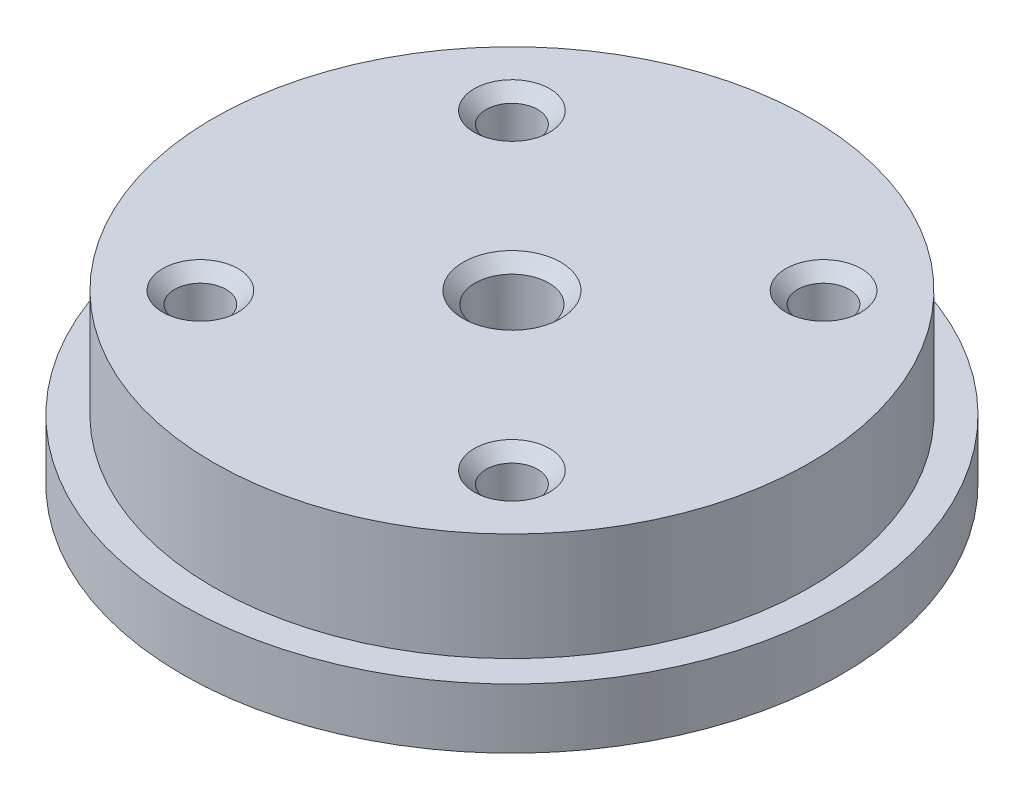
ISO-10303-21;
HEADER;
FILE_DESCRIPTION(('STEP AP214'),'2;1');
FILE_NAME('part.step','',(''),(''),'','','');
FILE_SCHEMA(('AUTOMOTIVE_DESIGN { 1 0 10303 214 1 1 1 1 }'));
ENDSEC;
DATA;
#1=APPLICATION_CONTEXT('core data for automotive mechanical design processes');
#2=APPLICATION_PROTOCOL_DEFINITION('international standard','automotive_design',2000,#1);
#3=PRODUCT_CONTEXT('',#1,'mechanical');
#4=PRODUCT('Part','Part','',(#3));
#5=PRODUCT_RELATED_PRODUCT_CATEGORY('part','',(#4));
#6=PRODUCT_DEFINITION_FORMATION('','',#4);
#7=PRODUCT_DEFINITION_CONTEXT('part definition',#1,'design');
#8=PRODUCT_DEFINITION('design','',#6,#7);
#9=PRODUCT_DEFINITION_SHAPE('','',#8);
#10=(LENGTH_UNIT() NAMED_UNIT(*) SI_UNIT(.MILLI.,.METRE.));
#11=(NAMED_UNIT(*) PLANE_ANGLE_UNIT() SI_UNIT($,.RADIAN.));
#12=(NAMED_UNIT(*) SI_UNIT($,.STERADIAN.) SOLID_ANGLE_UNIT());
#13=UNCERTAINTY_MEASURE_WITH_UNIT(LENGTH_MEASURE(1.E-05),#10,'distance_accuracy_value','');
#14=(GEOMETRIC_REPRESENTATION_CONTEXT(3) GLOBAL_UNCERTAINTY_ASSIGNED_CONTEXT((#13)) GLOBAL_UNIT_ASSIGNED_CONTEXT((#10,
#11,#12)) REPRESENTATION_CONTEXT('',''));
#15=CARTESIAN_POINT('',(0.,0.,0.));
#16=DIRECTION('',(0.,0.,1.));
#17=DIRECTION('',(1.,0.,0.));
#18=AXIS2_PLACEMENT_3D('',#15,#16,#17);
#19=CARTESIAN_POINT('',(10.6,0.,0.));
#20=DIRECTION('',(0.,1.,0.));
#21=DIRECTION('',(0.,0.,1.));
#22=AXIS2_PLACEMENT_3D('',#19,#20,#21);
#23=PLANE('',#22);
#24=CARTESIAN_POINT('',(0.,0.,-18.5));
#25=DIRECTION('',(0.,-1.,0.));
#26=DIRECTION('',(0.,0.,-1.));
#27=AXIS2_PLACEMENT_3D('',#24,#25,#26);
#28=CIRCLE('',#27,1.625);
#29=CARTESIAN_POINT('',(0.,0.,-20.125));
#30=VERTEX_POINT('',#29);
#31=EDGE_CURVE('E86',#30,#30,#28,.T.);
#32=ORIENTED_EDGE('',*,*,#31,.F.);
#33=EDGE_LOOP('',(#32));
#34=FACE_BOUND('',#33,.T.);
#35=CARTESIAN_POINT('',(-16.0214699700126,0.,-9.25000000000091));
#36=DIRECTION('',(0.,-1.,0.));
#37=DIRECTION('',(0.,0.,-1.));
#38=AXIS2_PLACEMENT_3D('',#35,#36,#37);
#39=CIRCLE('',#38,1.625);
#40=CARTESIAN_POINT('',(-16.0214699700126,0.,-10.8750000000009));
#41=VERTEX_POINT('',#40);
#42=EDGE_CURVE('E84',#41,#41,#39,.T.);
#43=ORIENTED_EDGE('',*,*,#42,.F.);
#44=EDGE_LOOP('',(#43));
#45=FACE_BOUND('',#44,.T.);
#46=CARTESIAN_POINT('',(-16.0214699700137,0.,9.24999999999909));
#47=DIRECTION('',(0.,-1.,0.));
#48=DIRECTION('',(0.,0.,-1.));
#49=AXIS2_PLACEMENT_3D('',#46,#47,#48);
#50=CIRCLE('',#49,1.625);
#51=CARTESIAN_POINT('',(-16.0214699700137,0.,7.62499999999909));
#52=VERTEX_POINT('',#51);
#53=EDGE_CURVE('E100',#52,#52,#50,.T.);
#54=ORIENTED_EDGE('',*,*,#53,.F.);
#55=EDGE_LOOP('',(#54));
#56=FACE_BOUND('',#55,.T.);
#57=CARTESIAN_POINT('',(16.0214699700105,0.,9.25000000000091));
#58=DIRECTION('',(0.,-1.,0.));
#59=DIRECTION('',(0.,0.,-1.));
#60=AXIS2_PLACEMENT_3D('',#57,#58,#59);
#61=CIRCLE('',#60,1.625);
#62=CARTESIAN_POINT('',(16.0214699700105,0.,7.62500000000091));
#63=VERTEX_POINT('',#62);
#64=EDGE_CURVE('E113',#63,#63,#61,.T.);
#65=ORIENTED_EDGE('',*,*,#64,.F.);
#66=EDGE_LOOP('',(#65));
#67=FACE_BOUND('',#66,.T.);
#68=CARTESIAN_POINT('',(16.0214699700116,0.,-9.24999999999909));
#69=DIRECTION('',(0.,-1.,0.));
#70=DIRECTION('',(0.,0.,-1.));
#71=AXIS2_PLACEMENT_3D('',#68,#69,#70);
#72=CIRCLE('',#71,1.625);
#73=CARTESIAN_POINT('',(16.0214699700116,0.,-10.8749999999991));
#74=VERTEX_POINT('',#73);
#75=EDGE_CURVE('E123',#74,#74,#72,.T.);
#76=ORIENTED_EDGE('',*,*,#75,.F.);
#77=EDGE_LOOP('',(#76));
#78=FACE_BOUND('',#77,.T.);
#79=CARTESIAN_POINT('',(0.,0.,0.));
#80=DIRECTION('',(0.,1.,0.));
#81=DIRECTION('',(0.,0.,1.));
#82=AXIS2_PLACEMENT_3D('',#79,#80,#81);
#83=CIRCLE('',#82,27.5);
#84=CARTESIAN_POINT('',(0.,0.,27.5));
#85=VERTEX_POINT('',#84);
#86=EDGE_CURVE('E151',#85,#85,#83,.T.);
#87=ORIENTED_EDGE('',*,*,#86,.F.);
#88=EDGE_LOOP('',(#87));
#89=FACE_BOUND('',#88,.T.);
#90=CARTESIAN_POINT('',(0.,0.,0.));
#91=DIRECTION('',(0.,1.,0.));
#92=DIRECTION('',(0.,0.,1.));
#93=AXIS2_PLACEMENT_3D('',#90,#91,#92);
#94=CIRCLE('',#93,10.6);
#95=CARTESIAN_POINT('',(0.,0.,10.6));
#96=VERTEX_POINT('',#95);
#97=EDGE_CURVE('E152',#96,#96,#94,.T.);
#98=ORIENTED_EDGE('',*,*,#97,.T.);
#99=EDGE_LOOP('',(#98));
#100=FACE_BOUND('',#99,.T.);
#101=CARTESIAN_POINT('',(-2.09640970811463E-12,0.,18.5));
#102=DIRECTION('',(0.,-1.,0.));
#103=DIRECTION('',(0.,0.,-1.));
#104=AXIS2_PLACEMENT_3D('',#101,#102,#103);
#105=CIRCLE('',#104,1.625);
#106=CARTESIAN_POINT('',(-2.09640970811463E-12,0.,16.875));
#107=VERTEX_POINT('',#106);
#108=EDGE_CURVE('E106',#107,#107,#105,.T.);
#109=ORIENTED_EDGE('',*,*,#108,.F.);
#110=EDGE_LOOP('',(#109));
#111=FACE_BOUND('',#110,.T.);
#112=ADVANCED_FACE('F43',(#34,#45,#56,#67,#78,#89,#100,#111),#23,.F.);
#113=CARTESIAN_POINT('',(0.,0.,0.));
#114=DIRECTION('',(0.,1.,0.));
#115=DIRECTION('',(0.,0.,1.));
#116=AXIS2_PLACEMENT_3D('',#113,#114,#115);
#117=CYLINDRICAL_SURFACE('',#116,10.6);
#118=ORIENTED_EDGE('',*,*,#97,.F.);
#119=EDGE_LOOP('',(#118));
#120=FACE_BOUND('',#119,.T.);
#121=CARTESIAN_POINT('',(0.,5.,0.));
#122=DIRECTION('',(0.,1.,0.));
#123=DIRECTION('',(0.,0.,1.));
#124=AXIS2_PLACEMENT_3D('',#121,#122,#123);
#125=CIRCLE('',#124,10.6);
#126=CARTESIAN_POINT('',(0.,5.,10.6));
#127=VERTEX_POINT('',#126);
#128=EDGE_CURVE('E131',#127,#127,#125,.T.);
#129=ORIENTED_EDGE('',*,*,#128,.T.);
#130=EDGE_LOOP('',(#129));
#131=FACE_BOUND('',#130,.T.);
#132=ADVANCED_FACE('F202',(#120,#131),#117,.F.);
#133=CARTESIAN_POINT('',(0.,0.,0.));
#134=DIRECTION('',(0.,1.,0.));
#135=DIRECTION('',(0.,0.,1.));
#136=AXIS2_PLACEMENT_3D('',#133,#134,#135);
#137=CYLINDRICAL_SURFACE('',#136,27.5);
#138=CARTESIAN_POINT('',(0.,5.,0.));
#139=DIRECTION('',(0.,1.,0.));
#140=DIRECTION('',(0.,0.,1.));
#141=AXIS2_PLACEMENT_3D('',#138,#139,#140);
#142=CIRCLE('',#141,27.5);
#143=CARTESIAN_POINT('',(0.,5.,27.5));
#144=VERTEX_POINT('',#143);
#145=EDGE_CURVE('E146',#144,#144,#142,.T.);
#146=ORIENTED_EDGE('',*,*,#145,.F.);
#147=EDGE_LOOP('',(#146));
#148=FACE_BOUND('',#147,.T.);
#149=ORIENTED_EDGE('',*,*,#86,.T.);
#150=EDGE_LOOP('',(#149));
#151=FACE_BOUND('',#150,.T.);
#152=ADVANCED_FACE('F213',(#148,#151),#137,.T.);
#153=CARTESIAN_POINT('',(27.5,5.,0.));
#154=DIRECTION('',(0.,-1.,0.));
#155=DIRECTION('',(0.,0.,-1.));
#156=AXIS2_PLACEMENT_3D('',#153,#154,#155);
#157=PLANE('',#156);
#158=CARTESIAN_POINT('',(0.,5.,0.));
#159=DIRECTION('',(0.,1.,0.));
#160=DIRECTION('',(0.,0.,1.));
#161=AXIS2_PLACEMENT_3D('',#158,#159,#160);
#162=CIRCLE('',#161,24.9);
#163=CARTESIAN_POINT('',(0.,5.,24.9));
#164=VERTEX_POINT('',#163);
#165=EDGE_CURVE('E144',#164,#164,#162,.T.);
#166=ORIENTED_EDGE('',*,*,#165,.F.);
#167=EDGE_LOOP('',(#166));
#168=FACE_BOUND('',#167,.T.);
#169=ORIENTED_EDGE('',*,*,#145,.T.);
#170=EDGE_LOOP('',(#169));
#171=FACE_BOUND('',#170,.T.);
#172=ADVANCED_FACE('F351',(#168,#171),#157,.F.);
#173=CARTESIAN_POINT('',(0.,0.,0.));
#174=DIRECTION('',(0.,1.,0.));
#175=DIRECTION('',(0.,0.,1.));
#176=AXIS2_PLACEMENT_3D('',#173,#174,#175);
#177=CYLINDRICAL_SURFACE('',#176,24.9);
#178=CARTESIAN_POINT('',(0.,14.,0.));
#179=DIRECTION('',(0.,1.,0.));
#180=DIRECTION('',(0.,0.,1.));
#181=AXIS2_PLACEMENT_3D('',#178,#179,#180);
#182=CIRCLE('',#181,24.9);
#183=CARTESIAN_POINT('',(0.,14.,24.9));
#184=VERTEX_POINT('',#183);
#185=EDGE_CURVE('E142',#184,#184,#182,.T.);
#186=ORIENTED_EDGE('',*,*,#185,.F.);
#187=EDGE_LOOP('',(#186));
#188=FACE_BOUND('',#187,.T.);
#189=ORIENTED_EDGE('',*,*,#165,.T.);
#190=EDGE_LOOP('',(#189));
#191=FACE_BOUND('',#190,.T.);
#192=ADVANCED_FACE('F348',(#188,#191),#177,.T.);
#193=CARTESIAN_POINT('',(24.9,14.,0.));
#194=DIRECTION('',(0.,-1.,0.));
#195=DIRECTION('',(0.,0.,-1.));
#196=AXIS2_PLACEMENT_3D('',#193,#194,#195);
#197=PLANE('',#196);
#198=CARTESIAN_POINT('',(13.,14.,13.));
#199=DIRECTION('',(0.,-1.,0.));
#200=DIRECTION('',(0.,0.,-1.));
#201=AXIS2_PLACEMENT_3D('',#198,#199,#200);
#202=CIRCLE('',#201,3.15000000000002);
#203=CARTESIAN_POINT('',(13.,14.,9.84999999999998));
#204=VERTEX_POINT('',#203);
#205=EDGE_CURVE('E179',#204,#204,#202,.T.);
#206=ORIENTED_EDGE('',*,*,#205,.T.);
#207=EDGE_LOOP('',(#206));
#208=FACE_BOUND('',#207,.T.);
#209=CARTESIAN_POINT('',(13.,14.,-13.));
#210=DIRECTION('',(0.,-1.,0.));
#211=DIRECTION('',(0.,0.,-1.));
#212=AXIS2_PLACEMENT_3D('',#209,#210,#211);
#213=CIRCLE('',#212,3.15000000000002);
#214=CARTESIAN_POINT('',(13.,14.,-16.15));
#215=VERTEX_POINT('',#214);
#216=EDGE_CURVE('E171',#215,#215,#213,.T.);
#217=ORIENTED_EDGE('',*,*,#216,.T.);
#218=EDGE_LOOP('',(#217));
#219=FACE_BOUND('',#218,.T.);
#220=CARTESIAN_POINT('',(-13.,14.,-13.));
#221=DIRECTION('',(0.,-1.,0.));
#222=DIRECTION('',(0.,0.,-1.));
#223=AXIS2_PLACEMENT_3D('',#220,#221,#222);
#224=CIRCLE('',#223,3.15000000000002);
#225=CARTESIAN_POINT('',(-13.,14.,-16.15));
#226=VERTEX_POINT('',#225);
#227=EDGE_CURVE('E168',#226,#226,#224,.T.);
#228=ORIENTED_EDGE('',*,*,#227,.T.);
#229=EDGE_LOOP('',(#228));
#230=FACE_BOUND('',#229,.T.);
#231=CARTESIAN_POINT('',(0.,14.,0.));
#232=DIRECTION('',(0.,-1.,0.));
#233=DIRECTION('',(0.,0.,-1.));
#234=AXIS2_PLACEMENT_3D('',#231,#232,#233);
#235=CIRCLE('',#234,4.075);
#236=CARTESIAN_POINT('',(0.,14.,-4.075));
#237=VERTEX_POINT('',#236);
#238=EDGE_CURVE('E170',#237,#237,#235,.T.);
#239=ORIENTED_EDGE('',*,*,#238,.T.);
#240=EDGE_LOOP('',(#239));
#241=FACE_BOUND('',#240,.T.);
#242=CARTESIAN_POINT('',(-13.,14.,13.));
#243=DIRECTION('',(0.,-1.,0.));
#244=DIRECTION('',(0.,0.,-1.));
#245=AXIS2_PLACEMENT_3D('',#242,#243,#244);
#246=CIRCLE('',#245,3.15000000000002);
#247=CARTESIAN_POINT('',(-13.,14.,9.84999999999998));
#248=VERTEX_POINT('',#247);
#249=EDGE_CURVE('E163',#248,#248,#246,.T.);
#250=ORIENTED_EDGE('',*,*,#249,.T.);
#251=EDGE_LOOP('',(#250));
#252=FACE_BOUND('',#251,.T.);
#253=ORIENTED_EDGE('',*,*,#185,.T.);
#254=EDGE_LOOP('',(#253));
#255=FACE_BOUND('',#254,.T.);
#256=ADVANCED_FACE('F347',(#208,#219,#230,#241,#252,#255),#197,.F.);
#257=CARTESIAN_POINT('',(0.,5.5,0.));
#258=DIRECTION('',(0.,1.,0.));
#259=DIRECTION('',(0.,0.,1.));
#260=AXIS2_PLACEMENT_3D('',#257,#258,#259);
#261=PLANE('',#260);
#262=CARTESIAN_POINT('',(0.,5.5,0.));
#263=DIRECTION('',(0.,1.,0.));
#264=DIRECTION('',(0.,0.,1.));
#265=AXIS2_PLACEMENT_3D('',#262,#263,#264);
#266=CIRCLE('',#265,3.075);
#267=CARTESIAN_POINT('',(0.,5.5,3.075));
#268=VERTEX_POINT('',#267);
#269=EDGE_CURVE('E158',#268,#268,#266,.T.);
#270=ORIENTED_EDGE('',*,*,#269,.T.);
#271=EDGE_LOOP('',(#270));
#272=FACE_BOUND('',#271,.T.);
#273=CARTESIAN_POINT('',(0.,5.5,0.));
#274=DIRECTION('',(0.,1.,0.));
#275=DIRECTION('',(0.,0.,1.));
#276=AXIS2_PLACEMENT_3D('',#273,#274,#275);
#277=CIRCLE('',#276,7.5);
#278=CARTESIAN_POINT('',(0.,5.5,7.5));
#279=VERTEX_POINT('',#278);
#280=EDGE_CURVE('E138',#279,#279,#277,.T.);
#281=ORIENTED_EDGE('',*,*,#280,.F.);
#282=EDGE_LOOP('',(#281));
#283=FACE_BOUND('',#282,.T.);
#284=ADVANCED_FACE('F345',(#272,#283),#261,.F.);
#285=CARTESIAN_POINT('',(0.,0.,0.));
#286=DIRECTION('',(0.,1.,0.));
#287=DIRECTION('',(0.,0.,1.));
#288=AXIS2_PLACEMENT_3D('',#285,#286,#287);
#289=CYLINDRICAL_SURFACE('',#288,7.5);
#290=CARTESIAN_POINT('',(0.,5.,0.));
#291=DIRECTION('',(0.,1.,0.));
#292=DIRECTION('',(0.,0.,1.));
#293=AXIS2_PLACEMENT_3D('',#290,#291,#292);
#294=CIRCLE('',#293,7.5);
#295=CARTESIAN_POINT('',(0.,5.,7.5));
#296=VERTEX_POINT('',#295);
#297=EDGE_CURVE('E139',#296,#296,#294,.T.);
#298=ORIENTED_EDGE('',*,*,#297,.F.);
#299=EDGE_LOOP('',(#298));
#300=FACE_BOUND('',#299,.T.);
#301=ORIENTED_EDGE('',*,*,#280,.T.);
#302=EDGE_LOOP('',(#301));
#303=FACE_BOUND('',#302,.T.);
#304=ADVANCED_FACE('F337',(#300,#303),#289,.F.);
#305=CARTESIAN_POINT('',(7.5,5.,0.));
#306=DIRECTION('',(0.,1.,0.));
#307=DIRECTION('',(0.,0.,1.));
#308=AXIS2_PLACEMENT_3D('',#305,#306,#307);
#309=PLANE('',#308);
#310=ORIENTED_EDGE('',*,*,#128,.F.);
#311=EDGE_LOOP('',(#310));
#312=FACE_BOUND('',#311,.T.);
#313=ORIENTED_EDGE('',*,*,#297,.T.);
#314=EDGE_LOOP('',(#313));
#315=FACE_BOUND('',#314,.T.);
#316=ADVANCED_FACE('F340',(#312,#315),#309,.F.);
#317=CARTESIAN_POINT('',(16.0214699700116,9.,-9.24999999999909));
#318=DIRECTION('',(0.,-1.,0.));
#319=DIRECTION('',(0.,0.,-1.));
#320=AXIS2_PLACEMENT_3D('',#317,#318,#319);
#321=CONICAL_SURFACE('',#320,1.25,1.02974425867665);
#322=CARTESIAN_POINT('',(16.0214699700116,9.75107577378445,-9.24999999999909));
#323=VERTEX_POINT('',#322);
#324=VERTEX_LOOP('',#323);
#325=FACE_BOUND('',#324,.T.);
#326=CARTESIAN_POINT('',(16.0214699700116,9.,-9.24999999999909));
#327=DIRECTION('',(0.,-1.,0.));
#328=DIRECTION('',(0.,0.,-1.));
#329=AXIS2_PLACEMENT_3D('',#326,#327,#328);
#330=CIRCLE('',#329,1.25);
#331=CARTESIAN_POINT('',(16.0214699700116,9.,-10.4999999999991));
#332=VERTEX_POINT('',#331);
#333=EDGE_CURVE('E128',#332,#332,#330,.T.);
#334=ORIENTED_EDGE('',*,*,#333,.T.);
#335=EDGE_LOOP('',(#334));
#336=FACE_BOUND('',#335,.T.);
#337=ADVANCED_FACE('F331',(#325,#336),#321,.F.);
#338=CARTESIAN_POINT('',(16.0214699700116,0.,-9.24999999999909));
#339=DIRECTION('',(0.,-1.,0.));
#340=DIRECTION('',(0.,0.,-1.));
#341=AXIS2_PLACEMENT_3D('',#338,#339,#340);
#342=CYLINDRICAL_SURFACE('',#341,1.25);
#343=ORIENTED_EDGE('',*,*,#333,.F.);
#344=EDGE_LOOP('',(#343));
#345=FACE_BOUND('',#344,.T.);
#346=CARTESIAN_POINT('',(16.0214699700116,0.375,-9.24999999999909));
#347=DIRECTION('',(0.,-1.,0.));
#348=DIRECTION('',(0.,0.,-1.));
#349=AXIS2_PLACEMENT_3D('',#346,#347,#348);
#350=CIRCLE('',#349,1.25);
#351=CARTESIAN_POINT('',(16.0214699700116,0.375,-10.4999999999991));
#352=VERTEX_POINT('',#351);
#353=EDGE_CURVE('E130',#352,#352,#350,.T.);
#354=ORIENTED_EDGE('',*,*,#353,.T.);
#355=EDGE_LOOP('',(#354));
#356=FACE_BOUND('',#355,.T.);
#357=ADVANCED_FACE('F329',(#345,#356),#342,.F.);
#358=CARTESIAN_POINT('',(16.0214699700116,0.,-9.24999999999909));
#359=DIRECTION('',(0.,-1.,0.));
#360=DIRECTION('',(0.,0.,-1.));
#361=AXIS2_PLACEMENT_3D('',#358,#359,#360);
#362=CONICAL_SURFACE('',#361,1.625,0.785398163397453);
#363=ORIENTED_EDGE('',*,*,#353,.F.);
#364=EDGE_LOOP('',(#363));
#365=FACE_BOUND('',#364,.T.);
#366=ORIENTED_EDGE('',*,*,#75,.T.);
#367=EDGE_LOOP('',(#366));
#368=FACE_BOUND('',#367,.T.);
#369=ADVANCED_FACE('F330',(#365,#368),#362,.F.);
#370=CARTESIAN_POINT('',(16.0214699700105,9.,9.25000000000091));
#371=DIRECTION('',(0.,-1.,0.));
#372=DIRECTION('',(0.,0.,-1.));
#373=AXIS2_PLACEMENT_3D('',#370,#371,#372);
#374=CONICAL_SURFACE('',#373,1.25,1.02974425867665);
#375=CARTESIAN_POINT('',(16.0214699700105,9.75107577378445,9.25000000000091));
#376=VERTEX_POINT('',#375);
#377=VERTEX_LOOP('',#376);
#378=FACE_BOUND('',#377,.T.);
#379=CARTESIAN_POINT('',(16.0214699700105,9.,9.25000000000091));
#380=DIRECTION('',(0.,-1.,0.));
#381=DIRECTION('',(0.,0.,-1.));
#382=AXIS2_PLACEMENT_3D('',#379,#380,#381);
#383=CIRCLE('',#382,1.25);
#384=CARTESIAN_POINT('',(16.0214699700105,9.,8.00000000000092));
#385=VERTEX_POINT('',#384);
#386=EDGE_CURVE('E124',#385,#385,#383,.T.);
#387=ORIENTED_EDGE('',*,*,#386,.T.);
#388=EDGE_LOOP('',(#387));
#389=FACE_BOUND('',#388,.T.);
#390=ADVANCED_FACE('F323',(#378,#389),#374,.F.);
#391=CARTESIAN_POINT('',(16.0214699700105,0.,9.25000000000091));
#392=DIRECTION('',(0.,-1.,0.));
#393=DIRECTION('',(0.,0.,-1.));
#394=AXIS2_PLACEMENT_3D('',#391,#392,#393);
#395=CYLINDRICAL_SURFACE('',#394,1.25);
#396=ORIENTED_EDGE('',*,*,#386,.F.);
#397=EDGE_LOOP('',(#396));
#398=FACE_BOUND('',#397,.T.);
#399=CARTESIAN_POINT('',(16.0214699700105,0.375,9.25000000000091));
#400=DIRECTION('',(0.,-1.,0.));
#401=DIRECTION('',(0.,0.,-1.));
#402=AXIS2_PLACEMENT_3D('',#399,#400,#401);
#403=CIRCLE('',#402,1.25);
#404=CARTESIAN_POINT('',(16.0214699700105,0.375,8.00000000000092));
#405=VERTEX_POINT('',#404);
#406=EDGE_CURVE('E116',#405,#405,#403,.T.);
#407=ORIENTED_EDGE('',*,*,#406,.T.);
#408=EDGE_LOOP('',(#407));
#409=FACE_BOUND('',#408,.T.);
#410=ADVANCED_FACE('F317',(#398,#409),#395,.F.);
#411=CARTESIAN_POINT('',(16.0214699700105,0.,9.25000000000091));
#412=DIRECTION('',(0.,-1.,0.));
#413=DIRECTION('',(0.,0.,-1.));
#414=AXIS2_PLACEMENT_3D('',#411,#412,#413);
#415=CONICAL_SURFACE('',#414,1.625,0.785398163397453);
#416=ORIENTED_EDGE('',*,*,#406,.F.);
#417=EDGE_LOOP('',(#416));
#418=FACE_BOUND('',#417,.T.);
#419=ORIENTED_EDGE('',*,*,#64,.T.);
#420=EDGE_LOOP('',(#419));
#421=FACE_BOUND('',#420,.T.);
#422=ADVANCED_FACE('F312',(#418,#421),#415,.F.);
#423=CARTESIAN_POINT('',(-2.09640970811463E-12,9.,18.5));
#424=DIRECTION('',(0.,-1.,0.));
#425=DIRECTION('',(0.,0.,-1.));
#426=AXIS2_PLACEMENT_3D('',#423,#424,#425);
#427=CONICAL_SURFACE('',#426,1.25,1.02974425867665);
#428=CARTESIAN_POINT('',(-2.09879803286155E-12,9.75107577378445,18.5));
#429=VERTEX_POINT('',#428);
#430=VERTEX_LOOP('',#429);
#431=FACE_BOUND('',#430,.T.);
#432=CARTESIAN_POINT('',(-2.09640970811463E-12,9.,18.5));
#433=DIRECTION('',(0.,-1.,0.));
#434=DIRECTION('',(0.,0.,-1.));
#435=AXIS2_PLACEMENT_3D('',#432,#433,#434);
#436=CIRCLE('',#435,1.25);
#437=CARTESIAN_POINT('',(-2.09640970811463E-12,9.,17.25));
#438=VERTEX_POINT('',#437);
#439=EDGE_CURVE('E115',#438,#438,#436,.T.);
#440=ORIENTED_EDGE('',*,*,#439,.T.);
#441=EDGE_LOOP('',(#440));
#442=FACE_BOUND('',#441,.T.);
#443=ADVANCED_FACE('F313',(#431,#442),#427,.F.);
#444=CARTESIAN_POINT('',(-2.09640970811463E-12,0.,18.5));
#445=DIRECTION('',(0.,-1.,0.));
#446=DIRECTION('',(0.,0.,-1.));
#447=AXIS2_PLACEMENT_3D('',#444,#445,#446);
#448=CYLINDRICAL_SURFACE('',#447,1.25);
#449=ORIENTED_EDGE('',*,*,#439,.F.);
#450=EDGE_LOOP('',(#449));
#451=FACE_BOUND('',#450,.T.);
#452=CARTESIAN_POINT('',(-2.09640970811463E-12,0.375,18.5));
#453=DIRECTION('',(0.,-1.,0.));
#454=DIRECTION('',(0.,0.,-1.));
#455=AXIS2_PLACEMENT_3D('',#452,#453,#454);
#456=CIRCLE('',#455,1.25);
#457=CARTESIAN_POINT('',(-2.09640970811463E-12,0.375,17.25));
#458=VERTEX_POINT('',#457);
#459=EDGE_CURVE('E108',#458,#458,#456,.T.);
#460=ORIENTED_EDGE('',*,*,#459,.T.);
#461=EDGE_LOOP('',(#460));
#462=FACE_BOUND('',#461,.T.);
#463=ADVANCED_FACE('F307',(#451,#462),#448,.F.);
#464=CARTESIAN_POINT('',(-2.09640970811463E-12,0.,18.5));
#465=DIRECTION('',(0.,-1.,0.));
#466=DIRECTION('',(0.,0.,-1.));
#467=AXIS2_PLACEMENT_3D('',#464,#465,#466);
#468=CONICAL_SURFACE('',#467,1.625,0.78539816339745);
#469=ORIENTED_EDGE('',*,*,#459,.F.);
#470=EDGE_LOOP('',(#469));
#471=FACE_BOUND('',#470,.T.);
#472=ORIENTED_EDGE('',*,*,#108,.T.);
#473=EDGE_LOOP('',(#472));
#474=FACE_BOUND('',#473,.T.);
#475=ADVANCED_FACE('F305',(#471,#474),#468,.F.);
#476=CARTESIAN_POINT('',(-16.0214699700137,9.,9.24999999999909));
#477=DIRECTION('',(0.,-1.,0.));
#478=DIRECTION('',(0.,0.,-1.));
#479=AXIS2_PLACEMENT_3D('',#476,#477,#478);
#480=CONICAL_SURFACE('',#479,1.25,1.02974425867665);
#481=CARTESIAN_POINT('',(-16.0214699700137,9.75107577378445,9.24999999999909));
#482=VERTEX_POINT('',#481);
#483=VERTEX_LOOP('',#482);
#484=FACE_BOUND('',#483,.T.);
#485=CARTESIAN_POINT('',(-16.0214699700137,9.,9.24999999999909));
#486=DIRECTION('',(0.,-1.,0.));
#487=DIRECTION('',(0.,0.,-1.));
#488=AXIS2_PLACEMENT_3D('',#485,#486,#487);
#489=CIRCLE('',#488,1.25);
#490=CARTESIAN_POINT('',(-16.0214699700137,9.,7.99999999999909));
#491=VERTEX_POINT('',#490);
#492=EDGE_CURVE('E103',#491,#491,#489,.T.);
#493=ORIENTED_EDGE('',*,*,#492,.T.);
#494=EDGE_LOOP('',(#493));
#495=FACE_BOUND('',#494,.T.);
#496=ADVANCED_FACE('F297',(#484,#495),#480,.F.);
#497=CARTESIAN_POINT('',(-16.0214699700137,0.,9.24999999999909));
#498=DIRECTION('',(0.,-1.,0.));
#499=DIRECTION('',(0.,0.,-1.));
#500=AXIS2_PLACEMENT_3D('',#497,#498,#499);
#501=CYLINDRICAL_SURFACE('',#500,1.25);
#502=ORIENTED_EDGE('',*,*,#492,.F.);
#503=EDGE_LOOP('',(#502));
#504=FACE_BOUND('',#503,.T.);
#505=CARTESIAN_POINT('',(-16.0214699700137,0.375,9.24999999999909));
#506=DIRECTION('',(0.,-1.,0.));
#507=DIRECTION('',(0.,0.,-1.));
#508=AXIS2_PLACEMENT_3D('',#505,#506,#507);
#509=CIRCLE('',#508,1.25);
#510=CARTESIAN_POINT('',(-16.0214699700137,0.375,7.99999999999909));
#511=VERTEX_POINT('',#510);
#512=EDGE_CURVE('E99',#511,#511,#509,.T.);
#513=ORIENTED_EDGE('',*,*,#512,.T.);
#514=EDGE_LOOP('',(#513));
#515=FACE_BOUND('',#514,.T.);
#516=ADVANCED_FACE('F293',(#504,#515),#501,.F.);
#517=CARTESIAN_POINT('',(-16.0214699700137,0.,9.24999999999909));
#518=DIRECTION('',(0.,-1.,0.));
#519=DIRECTION('',(0.,0.,-1.));
#520=AXIS2_PLACEMENT_3D('',#517,#518,#519);
#521=CONICAL_SURFACE('',#520,1.625,0.785398163397448);
#522=ORIENTED_EDGE('',*,*,#512,.F.);
#523=EDGE_LOOP('',(#522));
#524=FACE_BOUND('',#523,.T.);
#525=ORIENTED_EDGE('',*,*,#53,.T.);
#526=EDGE_LOOP('',(#525));
#527=FACE_BOUND('',#526,.T.);
#528=ADVANCED_FACE('F292',(#524,#527),#521,.F.);
#529=CARTESIAN_POINT('',(-16.0214699700126,9.,-9.25000000000091));
#530=DIRECTION('',(0.,-1.,0.));
#531=DIRECTION('',(0.,0.,-1.));
#532=AXIS2_PLACEMENT_3D('',#529,#530,#531);
#533=CONICAL_SURFACE('',#532,1.25,1.02974425867665);
#534=CARTESIAN_POINT('',(-16.0214699700126,9.75107577378445,-9.25000000000091));
#535=VERTEX_POINT('',#534);
#536=VERTEX_LOOP('',#535);
#537=FACE_BOUND('',#536,.T.);
#538=CARTESIAN_POINT('',(-16.0214699700126,9.,-9.25000000000091));
#539=DIRECTION('',(0.,-1.,0.));
#540=DIRECTION('',(0.,0.,-1.));
#541=AXIS2_PLACEMENT_3D('',#538,#539,#540);
#542=CIRCLE('',#541,1.25);
#543=CARTESIAN_POINT('',(-16.0214699700126,9.,-10.5000000000009));
#544=VERTEX_POINT('',#543);
#545=EDGE_CURVE('E94',#544,#544,#542,.T.);
#546=ORIENTED_EDGE('',*,*,#545,.T.);
#547=EDGE_LOOP('',(#546));
#548=FACE_BOUND('',#547,.T.);
#549=ADVANCED_FACE('F286',(#537,#548),#533,.F.);
#550=CARTESIAN_POINT('',(-16.0214699700126,0.,-9.25000000000091));
#551=DIRECTION('',(0.,-1.,0.));
#552=DIRECTION('',(0.,0.,-1.));
#553=AXIS2_PLACEMENT_3D('',#550,#551,#552);
#554=CYLINDRICAL_SURFACE('',#553,1.25);
#555=ORIENTED_EDGE('',*,*,#545,.F.);
#556=EDGE_LOOP('',(#555));
#557=FACE_BOUND('',#556,.T.);
#558=CARTESIAN_POINT('',(-16.0214699700126,0.375,-9.25000000000091));
#559=DIRECTION('',(0.,-1.,0.));
#560=DIRECTION('',(0.,0.,-1.));
#561=AXIS2_PLACEMENT_3D('',#558,#559,#560);
#562=CIRCLE('',#561,1.25);
#563=CARTESIAN_POINT('',(-16.0214699700126,0.375,-10.5000000000009));
#564=VERTEX_POINT('',#563);
#565=EDGE_CURVE('E82',#564,#564,#562,.T.);
#566=ORIENTED_EDGE('',*,*,#565,.T.);
#567=EDGE_LOOP('',(#566));
#568=FACE_BOUND('',#567,.T.);
#569=ADVANCED_FACE('F281',(#557,#568),#554,.F.);
#570=CARTESIAN_POINT('',(-16.0214699700126,0.,-9.25000000000091));
#571=DIRECTION('',(0.,-1.,0.));
#572=DIRECTION('',(0.,0.,-1.));
#573=AXIS2_PLACEMENT_3D('',#570,#571,#572);
#574=CONICAL_SURFACE('',#573,1.625,0.785398163397448);
#575=ORIENTED_EDGE('',*,*,#565,.F.);
#576=EDGE_LOOP('',(#575));
#577=FACE_BOUND('',#576,.T.);
#578=ORIENTED_EDGE('',*,*,#42,.T.);
#579=EDGE_LOOP('',(#578));
#580=FACE_BOUND('',#579,.T.);
#581=ADVANCED_FACE('F73',(#577,#580),#574,.F.);
#582=CARTESIAN_POINT('',(0.,9.,-18.5));
#583=DIRECTION('',(0.,-1.,0.));
#584=DIRECTION('',(0.,0.,-1.));
#585=AXIS2_PLACEMENT_3D('',#582,#583,#584);
#586=CONICAL_SURFACE('',#585,1.25,1.02974425867665);
#587=CARTESIAN_POINT('',(0.,9.75107577378445,-18.5));
#588=VERTEX_POINT('',#587);
#589=VERTEX_LOOP('',#588);
#590=FACE_BOUND('',#589,.T.);
#591=CARTESIAN_POINT('',(0.,9.,-18.5));
#592=DIRECTION('',(0.,-1.,0.));
#593=DIRECTION('',(0.,0.,-1.));
#594=AXIS2_PLACEMENT_3D('',#591,#592,#593);
#595=CIRCLE('',#594,1.25);
#596=CARTESIAN_POINT('',(0.,9.,-19.75));
#597=VERTEX_POINT('',#596);
#598=EDGE_CURVE('E77',#597,#597,#595,.T.);
#599=ORIENTED_EDGE('',*,*,#598,.T.);
#600=EDGE_LOOP('',(#599));
#601=FACE_BOUND('',#600,.T.);
#602=ADVANCED_FACE('F72',(#590,#601),#586,.F.);
#603=CARTESIAN_POINT('',(0.,0.,-18.5));
#604=DIRECTION('',(0.,-1.,0.));
#605=DIRECTION('',(0.,0.,-1.));
#606=AXIS2_PLACEMENT_3D('',#603,#604,#605);
#607=CYLINDRICAL_SURFACE('',#606,1.25);
#608=ORIENTED_EDGE('',*,*,#598,.F.);
#609=EDGE_LOOP('',(#608));
#610=FACE_BOUND('',#609,.T.);
#611=CARTESIAN_POINT('',(0.,0.375,-18.5));
#612=DIRECTION('',(0.,-1.,0.));
#613=DIRECTION('',(0.,0.,-1.));
#614=AXIS2_PLACEMENT_3D('',#611,#612,#613);
#615=CIRCLE('',#614,1.25);
#616=CARTESIAN_POINT('',(0.,0.375,-19.75));
#617=VERTEX_POINT('',#616);
#618=EDGE_CURVE('E81',#617,#617,#615,.T.);
#619=ORIENTED_EDGE('',*,*,#618,.T.);
#620=EDGE_LOOP('',(#619));
#621=FACE_BOUND('',#620,.T.);
#622=ADVANCED_FACE('F74',(#610,#621),#607,.F.);
#623=CARTESIAN_POINT('',(0.,0.,-18.5));
#624=DIRECTION('',(0.,-1.,0.));
#625=DIRECTION('',(0.,0.,-1.));
#626=AXIS2_PLACEMENT_3D('',#623,#624,#625);
#627=CONICAL_SURFACE('',#626,1.625,0.78539816339745);
#628=ORIENTED_EDGE('',*,*,#618,.F.);
#629=EDGE_LOOP('',(#628));
#630=FACE_BOUND('',#629,.T.);
#631=ORIENTED_EDGE('',*,*,#31,.T.);
#632=EDGE_LOOP('',(#631));
#633=FACE_BOUND('',#632,.T.);
#634=ADVANCED_FACE('F270',(#630,#633),#627,.F.);
#635=CARTESIAN_POINT('',(0.,5.,0.));
#636=DIRECTION('',(0.,1.,0.));
#637=DIRECTION('',(0.,0.,1.));
#638=AXIS2_PLACEMENT_3D('',#635,#636,#637);
#639=CYLINDRICAL_SURFACE('',#638,3.075);
#640=CARTESIAN_POINT('',(0.,13.,0.));
#641=DIRECTION('',(0.,-1.,0.));
#642=DIRECTION('',(0.,0.,-1.));
#643=AXIS2_PLACEMENT_3D('',#640,#641,#642);
#644=CIRCLE('',#643,3.075);
#645=CARTESIAN_POINT('',(0.,13.,-3.075));
#646=VERTEX_POINT('',#645);
#647=EDGE_CURVE('E55',#646,#646,#644,.F.);
#648=ORIENTED_EDGE('',*,*,#647,.T.);
#649=EDGE_LOOP('',(#648));
#650=FACE_BOUND('',#649,.T.);
#651=ORIENTED_EDGE('',*,*,#269,.F.);
#652=EDGE_LOOP('',(#651));
#653=FACE_BOUND('',#652,.T.);
#654=ADVANCED_FACE('F190',(#650,#653),#639,.F.);
#655=CARTESIAN_POINT('',(13.,5.,-13.));
#656=DIRECTION('',(0.,1.,0.));
#657=DIRECTION('',(0.,0.,1.));
#658=AXIS2_PLACEMENT_3D('',#655,#656,#657);
#659=CYLINDRICAL_SURFACE('',#658,2.15);
#660=CARTESIAN_POINT('',(13.,13.,-13.));
#661=DIRECTION('',(0.,-1.,0.));
#662=DIRECTION('',(0.,0.,-1.));
#663=AXIS2_PLACEMENT_3D('',#660,#661,#662);
#664=CIRCLE('',#663,2.15);
#665=CARTESIAN_POINT('',(13.,13.,-15.15));
#666=VERTEX_POINT('',#665);
#667=EDGE_CURVE('E178',#666,#666,#664,.F.);
#668=ORIENTED_EDGE('',*,*,#667,.T.);
#669=EDGE_LOOP('',(#668));
#670=FACE_BOUND('',#669,.T.);
#671=CARTESIAN_POINT('',(13.,5.,-13.));
#672=DIRECTION('',(0.,1.,0.));
#673=DIRECTION('',(0.,0.,1.));
#674=AXIS2_PLACEMENT_3D('',#671,#672,#673);
#675=CIRCLE('',#674,2.15);
#676=CARTESIAN_POINT('',(13.,5.,-10.85));
#677=VERTEX_POINT('',#676);
#678=EDGE_CURVE('E161',#677,#677,#675,.T.);
#679=ORIENTED_EDGE('',*,*,#678,.F.);
#680=EDGE_LOOP('',(#679));
#681=FACE_BOUND('',#680,.T.);
#682=ADVANCED_FACE('F246',(#670,#681),#659,.F.);
#683=CARTESIAN_POINT('',(13.,5.,-13.));
#684=DIRECTION('',(0.,1.,0.));
#685=DIRECTION('',(0.,0.,1.));
#686=AXIS2_PLACEMENT_3D('',#683,#684,#685);
#687=PLANE('',#686);
#688=ORIENTED_EDGE('',*,*,#678,.T.);
#689=EDGE_LOOP('',(#688));
#690=FACE_BOUND('',#689,.T.);
#691=ADVANCED_FACE('F247',(#690),#687,.T.);
#692=CARTESIAN_POINT('',(13.,5.,13.));
#693=DIRECTION('',(0.,1.,0.));
#694=DIRECTION('',(0.,0.,1.));
#695=AXIS2_PLACEMENT_3D('',#692,#693,#694);
#696=CYLINDRICAL_SURFACE('',#695,2.15);
#697=CARTESIAN_POINT('',(13.,13.,13.));
#698=DIRECTION('',(0.,-1.,0.));
#699=DIRECTION('',(0.,0.,-1.));
#700=AXIS2_PLACEMENT_3D('',#697,#698,#699);
#701=CIRCLE('',#700,2.15);
#702=CARTESIAN_POINT('',(13.,13.,10.85));
#703=VERTEX_POINT('',#702);
#704=EDGE_CURVE('E160',#703,#703,#701,.F.);
#705=ORIENTED_EDGE('',*,*,#704,.T.);
#706=EDGE_LOOP('',(#705));
#707=FACE_BOUND('',#706,.T.);
#708=CARTESIAN_POINT('',(13.,5.,13.));
#709=DIRECTION('',(0.,1.,0.));
#710=DIRECTION('',(0.,0.,1.));
#711=AXIS2_PLACEMENT_3D('',#708,#709,#710);
#712=CIRCLE('',#711,2.15);
#713=CARTESIAN_POINT('',(13.,5.,15.15));
#714=VERTEX_POINT('',#713);
#715=EDGE_CURVE('E254',#714,#714,#712,.T.);
#716=ORIENTED_EDGE('',*,*,#715,.F.);
#717=EDGE_LOOP('',(#716));
#718=FACE_BOUND('',#717,.T.);
#719=ADVANCED_FACE('F530',(#707,#718),#696,.F.);
#720=CARTESIAN_POINT('',(13.,5.,13.));
#721=DIRECTION('',(0.,1.,0.));
#722=DIRECTION('',(0.,0.,1.));
#723=AXIS2_PLACEMENT_3D('',#720,#721,#722);
#724=PLANE('',#723);
#725=ORIENTED_EDGE('',*,*,#715,.T.);
#726=EDGE_LOOP('',(#725));
#727=FACE_BOUND('',#726,.T.);
#728=ADVANCED_FACE('F540',(#727),#724,.T.);
#729=CARTESIAN_POINT('',(-13.,5.,13.));
#730=DIRECTION('',(0.,1.,0.));
#731=DIRECTION('',(0.,0.,1.));
#732=AXIS2_PLACEMENT_3D('',#729,#730,#731);
#733=CYLINDRICAL_SURFACE('',#732,2.15);
#734=CARTESIAN_POINT('',(-13.,13.,13.));
#735=DIRECTION('',(0.,-1.,0.));
#736=DIRECTION('',(0.,0.,-1.));
#737=AXIS2_PLACEMENT_3D('',#734,#735,#736);
#738=CIRCLE('',#737,2.15);
#739=CARTESIAN_POINT('',(-13.,13.,10.85));
#740=VERTEX_POINT('',#739);
#741=EDGE_CURVE('E11',#740,#740,#738,.F.);
#742=ORIENTED_EDGE('',*,*,#741,.T.);
#743=EDGE_LOOP('',(#742));
#744=FACE_BOUND('',#743,.T.);
#745=CARTESIAN_POINT('',(-13.,5.,13.));
#746=DIRECTION('',(0.,1.,0.));
#747=DIRECTION('',(0.,0.,1.));
#748=AXIS2_PLACEMENT_3D('',#745,#746,#747);
#749=CIRCLE('',#748,2.15);
#750=CARTESIAN_POINT('',(-13.,5.,15.15));
#751=VERTEX_POINT('',#750);
#752=EDGE_CURVE('E256',#751,#751,#749,.T.);
#753=ORIENTED_EDGE('',*,*,#752,.F.);
#754=EDGE_LOOP('',(#753));
#755=FACE_BOUND('',#754,.T.);
#756=ADVANCED_FACE('F546',(#744,#755),#733,.F.);
#757=CARTESIAN_POINT('',(-13.,5.,13.));
#758=DIRECTION('',(0.,1.,0.));
#759=DIRECTION('',(0.,0.,1.));
#760=AXIS2_PLACEMENT_3D('',#757,#758,#759);
#761=PLANE('',#760);
#762=ORIENTED_EDGE('',*,*,#752,.T.);
#763=EDGE_LOOP('',(#762));
#764=FACE_BOUND('',#763,.T.);
#765=ADVANCED_FACE('F553',(#764),#761,.T.);
#766=CARTESIAN_POINT('',(-13.,5.,-13.));
#767=DIRECTION('',(0.,1.,0.));
#768=DIRECTION('',(0.,0.,1.));
#769=AXIS2_PLACEMENT_3D('',#766,#767,#768);
#770=CYLINDRICAL_SURFACE('',#769,2.15);
#771=CARTESIAN_POINT('',(-13.,13.,-13.));
#772=DIRECTION('',(0.,-1.,0.));
#773=DIRECTION('',(0.,0.,-1.));
#774=AXIS2_PLACEMENT_3D('',#771,#772,#773);
#775=CIRCLE('',#774,2.15);
#776=CARTESIAN_POINT('',(-13.,13.,-15.15));
#777=VERTEX_POINT('',#776);
#778=EDGE_CURVE('E185',#777,#777,#775,.F.);
#779=ORIENTED_EDGE('',*,*,#778,.T.);
#780=EDGE_LOOP('',(#779));
#781=FACE_BOUND('',#780,.T.);
#782=CARTESIAN_POINT('',(-13.,5.,-13.));
#783=DIRECTION('',(0.,1.,0.));
#784=DIRECTION('',(0.,0.,1.));
#785=AXIS2_PLACEMENT_3D('',#782,#783,#784);
#786=CIRCLE('',#785,2.15);
#787=CARTESIAN_POINT('',(-13.,5.,-10.85));
#788=VERTEX_POINT('',#787);
#789=EDGE_CURVE('E263',#788,#788,#786,.T.);
#790=ORIENTED_EDGE('',*,*,#789,.F.);
#791=EDGE_LOOP('',(#790));
#792=FACE_BOUND('',#791,.T.);
#793=ADVANCED_FACE('F563',(#781,#792),#770,.F.);
#794=CARTESIAN_POINT('',(-13.,5.,-13.));
#795=DIRECTION('',(0.,1.,0.));
#796=DIRECTION('',(0.,0.,1.));
#797=AXIS2_PLACEMENT_3D('',#794,#795,#796);
#798=PLANE('',#797);
#799=ORIENTED_EDGE('',*,*,#789,.T.);
#800=EDGE_LOOP('',(#799));
#801=FACE_BOUND('',#800,.T.);
#802=ADVANCED_FACE('F226',(#801),#798,.T.);
#803=CARTESIAN_POINT('',(13.,13.,13.));
#804=DIRECTION('',(0.,1.,0.));
#805=DIRECTION('',(0.,0.,1.));
#806=AXIS2_PLACEMENT_3D('',#803,#804,#805);
#807=CONICAL_SURFACE('',#806,2.15,0.785398163397448);
#808=ORIENTED_EDGE('',*,*,#205,.F.);
#809=EDGE_LOOP('',(#808));
#810=FACE_BOUND('',#809,.T.);
#811=ORIENTED_EDGE('',*,*,#704,.F.);
#812=EDGE_LOOP('',(#811));
#813=FACE_BOUND('',#812,.T.);
#814=ADVANCED_FACE('F225',(#810,#813),#807,.F.);
#815=CARTESIAN_POINT('',(13.,13.,-13.));
#816=DIRECTION('',(0.,1.,0.));
#817=DIRECTION('',(0.,0.,1.));
#818=AXIS2_PLACEMENT_3D('',#815,#816,#817);
#819=CONICAL_SURFACE('',#818,2.15,0.785398163397449);
#820=ORIENTED_EDGE('',*,*,#216,.F.);
#821=EDGE_LOOP('',(#820));
#822=FACE_BOUND('',#821,.T.);
#823=ORIENTED_EDGE('',*,*,#667,.F.);
#824=EDGE_LOOP('',(#823));
#825=FACE_BOUND('',#824,.T.);
#826=ADVANCED_FACE('F200',(#822,#825),#819,.F.);
#827=CARTESIAN_POINT('',(-13.,13.,-13.));
#828=DIRECTION('',(0.,1.,0.));
#829=DIRECTION('',(0.,0.,1.));
#830=AXIS2_PLACEMENT_3D('',#827,#828,#829);
#831=CONICAL_SURFACE('',#830,2.15,0.785398163397449);
#832=ORIENTED_EDGE('',*,*,#227,.F.);
#833=EDGE_LOOP('',(#832));
#834=FACE_BOUND('',#833,.T.);
#835=ORIENTED_EDGE('',*,*,#778,.F.);
#836=EDGE_LOOP('',(#835));
#837=FACE_BOUND('',#836,.T.);
#838=ADVANCED_FACE('F191',(#834,#837),#831,.F.);
#839=CARTESIAN_POINT('',(0.,13.,0.));
#840=DIRECTION('',(0.,1.,0.));
#841=DIRECTION('',(0.,0.,1.));
#842=AXIS2_PLACEMENT_3D('',#839,#840,#841);
#843=CONICAL_SURFACE('',#842,3.075,0.78539816339745);
#844=ORIENTED_EDGE('',*,*,#238,.F.);
#845=EDGE_LOOP('',(#844));
#846=FACE_BOUND('',#845,.T.);
#847=ORIENTED_EDGE('',*,*,#647,.F.);
#848=EDGE_LOOP('',(#847));
#849=FACE_BOUND('',#848,.T.);
#850=ADVANCED_FACE('F189',(#846,#849),#843,.F.);
#851=CARTESIAN_POINT('',(-13.,13.,13.));
#852=DIRECTION('',(0.,1.,0.));
#853=DIRECTION('',(0.,0.,1.));
#854=AXIS2_PLACEMENT_3D('',#851,#852,#853);
#855=CONICAL_SURFACE('',#854,2.15,0.785398163397448);
#856=ORIENTED_EDGE('',*,*,#249,.F.);
#857=EDGE_LOOP('',(#856));
#858=FACE_BOUND('',#857,.T.);
#859=ORIENTED_EDGE('',*,*,#741,.F.);
#860=EDGE_LOOP('',(#859));
#861=FACE_BOUND('',#860,.T.);
#862=ADVANCED_FACE('F46',(#858,#861),#855,.F.);
#863=CLOSED_SHELL('',(#112,#132,#152,#172,#192,#256,#284,#304,#316,#337,#357,#369,#390,#410,
#422,#443,#463,#475,#496,#516,#528,#549,#569,#581,#602,#622,#634,#654,#682,#691,#719,#728,#756,
#765,#793,#802,#814,#826,#838,#850,#862));
#864=MANIFOLD_SOLID_BREP('B2',#863);
#865=ADVANCED_BREP_SHAPE_REPRESENTATION('',(#18,#864),#14);
#866=SHAPE_DEFINITION_REPRESENTATION(#9,#865);
ENDSEC;
END-ISO-10303-21;
